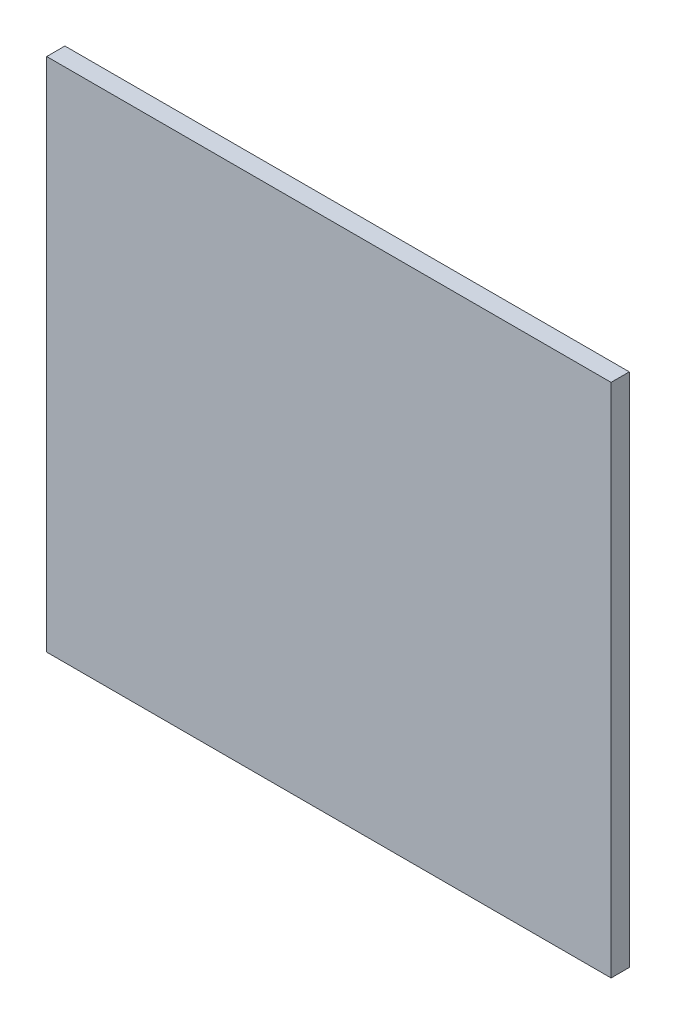
ISO-10303-21;
HEADER;
FILE_DESCRIPTION(('STEP AP214'),'2;1');
FILE_NAME('part.step','',(''),(''),'','','');
FILE_SCHEMA(('AUTOMOTIVE_DESIGN { 1 0 10303 214 1 1 1 1 }'));
ENDSEC;
DATA;
#1=APPLICATION_CONTEXT('core data for automotive mechanical design processes');
#2=APPLICATION_PROTOCOL_DEFINITION('international standard','automotive_design',2000,#1);
#3=PRODUCT_CONTEXT('',#1,'mechanical');
#4=PRODUCT('Part','Part','',(#3));
#5=PRODUCT_RELATED_PRODUCT_CATEGORY('part','',(#4));
#6=PRODUCT_DEFINITION_FORMATION('','',#4);
#7=PRODUCT_DEFINITION_CONTEXT('part definition',#1,'design');
#8=PRODUCT_DEFINITION('design','',#6,#7);
#9=PRODUCT_DEFINITION_SHAPE('','',#8);
#10=(LENGTH_UNIT() NAMED_UNIT(*) SI_UNIT(.MILLI.,.METRE.));
#11=(NAMED_UNIT(*) PLANE_ANGLE_UNIT() SI_UNIT($,.RADIAN.));
#12=(NAMED_UNIT(*) SI_UNIT($,.STERADIAN.) SOLID_ANGLE_UNIT());
#13=UNCERTAINTY_MEASURE_WITH_UNIT(LENGTH_MEASURE(1.E-05),#10,'distance_accuracy_value','');
#14=(GEOMETRIC_REPRESENTATION_CONTEXT(3) GLOBAL_UNCERTAINTY_ASSIGNED_CONTEXT((#13)) GLOBAL_UNIT_ASSIGNED_CONTEXT((#10,
#11,#12)) REPRESENTATION_CONTEXT('',''));
#15=CARTESIAN_POINT('',(0.,0.,0.));
#16=DIRECTION('',(0.,0.,1.));
#17=DIRECTION('',(1.,0.,0.));
#18=AXIS2_PLACEMENT_3D('',#15,#16,#17);
#19=CARTESIAN_POINT('',(0.,0.,6.));
#20=DIRECTION('',(-1.,0.,0.));
#21=DIRECTION('',(0.,0.,1.));
#22=AXIS2_PLACEMENT_3D('',#19,#20,#21);
#23=PLANE('',#22);
#24=DIRECTION('',(0.,1.,0.));
#25=VECTOR('',#24,1.);
#26=CARTESIAN_POINT('',(0.,0.,0.));
#27=LINE('',#26,#25);
#28=CARTESIAN_POINT('',(0.,0.,0.));
#29=VERTEX_POINT('',#28);
#30=CARTESIAN_POINT('',(0.,170.,0.));
#31=VERTEX_POINT('',#30);
#32=EDGE_CURVE('E96',#29,#31,#27,.T.);
#33=ORIENTED_EDGE('',*,*,#32,.T.);
#34=DIRECTION('',(0.,0.,-1.));
#35=VECTOR('',#34,1.);
#36=CARTESIAN_POINT('',(0.,170.,6.));
#37=LINE('',#36,#35);
#38=CARTESIAN_POINT('',(0.,170.,6.));
#39=VERTEX_POINT('',#38);
#40=EDGE_CURVE('E11',#39,#31,#37,.T.);
#41=ORIENTED_EDGE('',*,*,#40,.F.);
#42=DIRECTION('',(0.,1.,0.));
#43=VECTOR('',#42,1.);
#44=CARTESIAN_POINT('',(0.,0.,6.));
#45=LINE('',#44,#43);
#46=CARTESIAN_POINT('',(0.,0.,6.));
#47=VERTEX_POINT('',#46);
#48=EDGE_CURVE('E84',#47,#39,#45,.T.);
#49=ORIENTED_EDGE('',*,*,#48,.F.);
#50=DIRECTION('',(0.,0.,-1.));
#51=VECTOR('',#50,1.);
#52=CARTESIAN_POINT('',(0.,0.,6.));
#53=LINE('',#52,#51);
#54=EDGE_CURVE('E92',#47,#29,#53,.T.);
#55=ORIENTED_EDGE('',*,*,#54,.T.);
#56=EDGE_LOOP('',(#33,#41,#49,#55));
#57=FACE_BOUND('',#56,.T.);
#58=ADVANCED_FACE('F33',(#57),#23,.F.);
#59=CARTESIAN_POINT('',(0.,170.,6.));
#60=DIRECTION('',(0.,-1.,0.));
#61=DIRECTION('',(1.,0.,0.));
#62=AXIS2_PLACEMENT_3D('',#59,#60,#61);
#63=PLANE('',#62);
#64=DIRECTION('',(-1.,0.,0.));
#65=VECTOR('',#64,1.);
#66=CARTESIAN_POINT('',(0.,170.,0.));
#67=LINE('',#66,#65);
#68=CARTESIAN_POINT('',(-186.,170.,0.));
#69=VERTEX_POINT('',#68);
#70=EDGE_CURVE('E88',#31,#69,#67,.T.);
#71=ORIENTED_EDGE('',*,*,#70,.T.);
#72=DIRECTION('',(0.,0.,-1.));
#73=VECTOR('',#72,1.);
#74=CARTESIAN_POINT('',(-186.,170.,6.));
#75=LINE('',#74,#73);
#76=CARTESIAN_POINT('',(-186.,170.,6.));
#77=VERTEX_POINT('',#76);
#78=EDGE_CURVE('E41',#77,#69,#75,.T.);
#79=ORIENTED_EDGE('',*,*,#78,.F.);
#80=DIRECTION('',(-1.,0.,0.));
#81=VECTOR('',#80,1.);
#82=CARTESIAN_POINT('',(0.,170.,6.));
#83=LINE('',#82,#81);
#84=EDGE_CURVE('E79',#39,#77,#83,.T.);
#85=ORIENTED_EDGE('',*,*,#84,.F.);
#86=ORIENTED_EDGE('',*,*,#40,.T.);
#87=EDGE_LOOP('',(#71,#79,#85,#86));
#88=FACE_BOUND('',#87,.T.);
#89=ADVANCED_FACE('F87',(#88),#63,.F.);
#90=CARTESIAN_POINT('',(-186.,0.,6.));
#91=DIRECTION('',(1.,0.,0.));
#92=DIRECTION('',(0.,0.,-1.));
#93=AXIS2_PLACEMENT_3D('',#90,#91,#92);
#94=PLANE('',#93);
#95=DIRECTION('',(0.,-1.,0.));
#96=VECTOR('',#95,1.);
#97=CARTESIAN_POINT('',(-186.,0.,0.));
#98=LINE('',#97,#96);
#99=CARTESIAN_POINT('',(-186.,0.,0.));
#100=VERTEX_POINT('',#99);
#101=EDGE_CURVE('E66',#69,#100,#98,.T.);
#102=ORIENTED_EDGE('',*,*,#101,.T.);
#103=DIRECTION('',(0.,0.,-1.));
#104=VECTOR('',#103,1.);
#105=CARTESIAN_POINT('',(-186.,0.,6.));
#106=LINE('',#105,#104);
#107=CARTESIAN_POINT('',(-186.,0.,6.));
#108=VERTEX_POINT('',#107);
#109=EDGE_CURVE('E89',#108,#100,#106,.T.);
#110=ORIENTED_EDGE('',*,*,#109,.F.);
#111=DIRECTION('',(0.,-1.,0.));
#112=VECTOR('',#111,1.);
#113=CARTESIAN_POINT('',(-186.,0.,6.));
#114=LINE('',#113,#112);
#115=EDGE_CURVE('E82',#77,#108,#114,.T.);
#116=ORIENTED_EDGE('',*,*,#115,.F.);
#117=ORIENTED_EDGE('',*,*,#78,.T.);
#118=EDGE_LOOP('',(#102,#110,#116,#117));
#119=FACE_BOUND('',#118,.T.);
#120=ADVANCED_FACE('F90',(#119),#94,.F.);
#121=CARTESIAN_POINT('',(0.,0.,6.));
#122=DIRECTION('',(0.,1.,0.));
#123=DIRECTION('',(-1.,0.,0.));
#124=AXIS2_PLACEMENT_3D('',#121,#122,#123);
#125=PLANE('',#124);
#126=DIRECTION('',(1.,0.,0.));
#127=VECTOR('',#126,1.);
#128=CARTESIAN_POINT('',(0.,0.,0.));
#129=LINE('',#128,#127);
#130=EDGE_CURVE('E72',#100,#29,#129,.T.);
#131=ORIENTED_EDGE('',*,*,#130,.T.);
#132=ORIENTED_EDGE('',*,*,#54,.F.);
#133=DIRECTION('',(1.,0.,0.));
#134=VECTOR('',#133,1.);
#135=CARTESIAN_POINT('',(0.,0.,6.));
#136=LINE('',#135,#134);
#137=EDGE_CURVE('E49',#108,#47,#136,.T.);
#138=ORIENTED_EDGE('',*,*,#137,.F.);
#139=ORIENTED_EDGE('',*,*,#109,.T.);
#140=EDGE_LOOP('',(#131,#132,#138,#139));
#141=FACE_BOUND('',#140,.T.);
#142=ADVANCED_FACE('F103',(#141),#125,.F.);
#143=CARTESIAN_POINT('',(0.,0.,6.));
#144=DIRECTION('',(0.,0.,1.));
#145=DIRECTION('',(1.,0.,0.));
#146=AXIS2_PLACEMENT_3D('',#143,#144,#145);
#147=PLANE('',#146);
#148=ORIENTED_EDGE('',*,*,#48,.T.);
#149=ORIENTED_EDGE('',*,*,#84,.T.);
#150=ORIENTED_EDGE('',*,*,#115,.T.);
#151=ORIENTED_EDGE('',*,*,#137,.T.);
#152=EDGE_LOOP('',(#148,#149,#150,#151));
#153=FACE_BOUND('',#152,.T.);
#154=ADVANCED_FACE('F80',(#153),#147,.T.);
#155=CARTESIAN_POINT('',(0.,0.,0.));
#156=DIRECTION('',(0.,0.,1.));
#157=DIRECTION('',(1.,0.,0.));
#158=AXIS2_PLACEMENT_3D('',#155,#156,#157);
#159=PLANE('',#158);
#160=ORIENTED_EDGE('',*,*,#32,.F.);
#161=ORIENTED_EDGE('',*,*,#130,.F.);
#162=ORIENTED_EDGE('',*,*,#101,.F.);
#163=ORIENTED_EDGE('',*,*,#70,.F.);
#164=EDGE_LOOP('',(#160,#161,#162,#163));
#165=FACE_BOUND('',#164,.T.);
#166=ADVANCED_FACE('F106',(#165),#159,.F.);
#167=CLOSED_SHELL('',(#58,#89,#120,#142,#154,#166));
#168=MANIFOLD_SOLID_BREP('B2',#167);
#169=ADVANCED_BREP_SHAPE_REPRESENTATION('',(#18,#168),#14);
#170=SHAPE_DEFINITION_REPRESENTATION(#9,#169);
ENDSEC;
END-ISO-10303-21;
